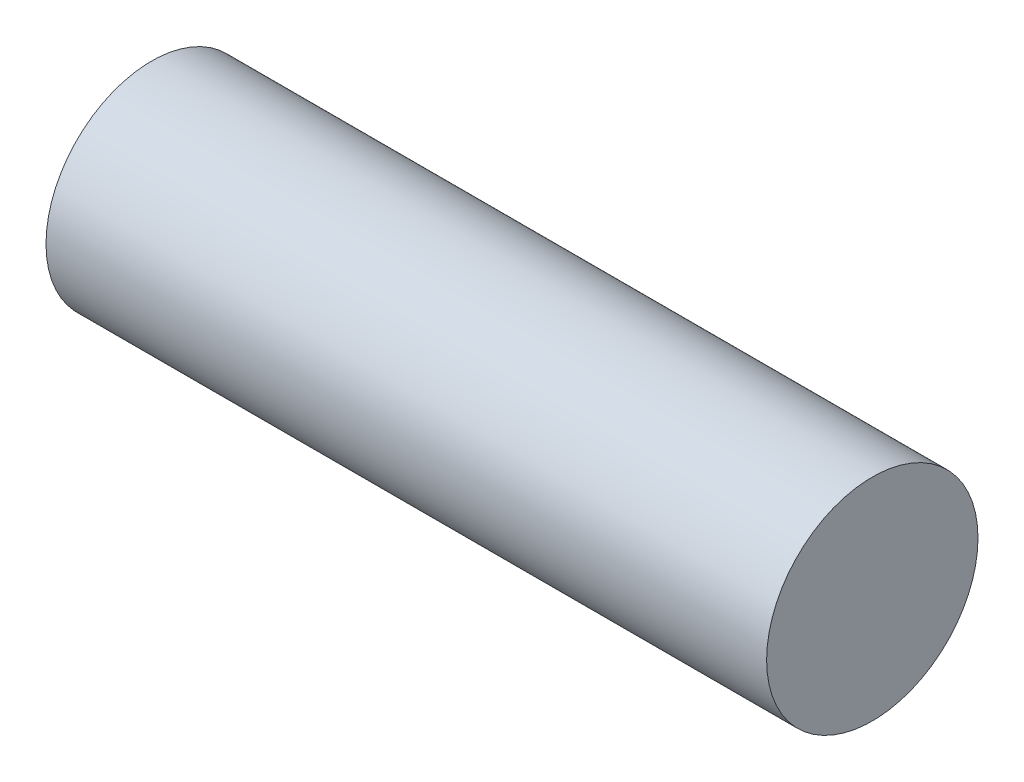
ISO-10303-21;
HEADER;
FILE_DESCRIPTION(('STEP AP214'),'2;1');
FILE_NAME('part.step','',(''),(''),'','','');
FILE_SCHEMA(('AUTOMOTIVE_DESIGN { 1 0 10303 214 1 1 1 1 }'));
ENDSEC;
DATA;
#1=APPLICATION_CONTEXT('core data for automotive mechanical design processes');
#2=APPLICATION_PROTOCOL_DEFINITION('international standard','automotive_design',2000,#1);
#3=PRODUCT_CONTEXT('',#1,'mechanical');
#4=PRODUCT('Part','Part','',(#3));
#5=PRODUCT_RELATED_PRODUCT_CATEGORY('part','',(#4));
#6=PRODUCT_DEFINITION_FORMATION('','',#4);
#7=PRODUCT_DEFINITION_CONTEXT('part definition',#1,'design');
#8=PRODUCT_DEFINITION('design','',#6,#7);
#9=PRODUCT_DEFINITION_SHAPE('','',#8);
#10=(LENGTH_UNIT() NAMED_UNIT(*) SI_UNIT(.MILLI.,.METRE.));
#11=(NAMED_UNIT(*) PLANE_ANGLE_UNIT() SI_UNIT($,.RADIAN.));
#12=(NAMED_UNIT(*) SI_UNIT($,.STERADIAN.) SOLID_ANGLE_UNIT());
#13=UNCERTAINTY_MEASURE_WITH_UNIT(LENGTH_MEASURE(1.E-05),#10,'distance_accuracy_value','');
#14=(GEOMETRIC_REPRESENTATION_CONTEXT(3) GLOBAL_UNCERTAINTY_ASSIGNED_CONTEXT((#13)) GLOBAL_UNIT_ASSIGNED_CONTEXT((#10,
#11,#12)) REPRESENTATION_CONTEXT('',''));
#15=CARTESIAN_POINT('',(0.,0.,0.));
#16=DIRECTION('',(0.,0.,1.));
#17=DIRECTION('',(1.,0.,0.));
#18=AXIS2_PLACEMENT_3D('',#15,#16,#17);
#19=CARTESIAN_POINT('',(30.,0.,0.));
#20=DIRECTION('',(-1.,0.,0.));
#21=DIRECTION('',(0.,0.,1.));
#22=AXIS2_PLACEMENT_3D('',#19,#20,#21);
#23=CYLINDRICAL_SURFACE('',#22,4.4);
#24=CARTESIAN_POINT('',(30.,0.,0.));
#25=DIRECTION('',(1.,0.,0.));
#26=DIRECTION('',(0.,0.,-1.));
#27=AXIS2_PLACEMENT_3D('',#24,#25,#26);
#28=CIRCLE('',#27,4.4);
#29=CARTESIAN_POINT('',(30.,0.,-4.4));
#30=VERTEX_POINT('',#29);
#31=EDGE_CURVE('E10',#30,#30,#28,.T.);
#32=ORIENTED_EDGE('',*,*,#31,.F.);
#33=EDGE_LOOP('',(#32));
#34=FACE_BOUND('',#33,.T.);
#35=CARTESIAN_POINT('',(0.,0.,0.));
#36=DIRECTION('',(1.,0.,0.));
#37=DIRECTION('',(0.,0.,-1.));
#38=AXIS2_PLACEMENT_3D('',#35,#36,#37);
#39=CIRCLE('',#38,4.4);
#40=CARTESIAN_POINT('',(0.,0.,-4.4));
#41=VERTEX_POINT('',#40);
#42=EDGE_CURVE('E46',#41,#41,#39,.T.);
#43=ORIENTED_EDGE('',*,*,#42,.T.);
#44=EDGE_LOOP('',(#43));
#45=FACE_BOUND('',#44,.T.);
#46=ADVANCED_FACE('F43',(#34,#45),#23,.T.);
#47=CARTESIAN_POINT('',(30.,0.,0.));
#48=DIRECTION('',(1.,0.,0.));
#49=DIRECTION('',(0.,0.,-1.));
#50=AXIS2_PLACEMENT_3D('',#47,#48,#49);
#51=PLANE('',#50);
#52=ORIENTED_EDGE('',*,*,#31,.T.);
#53=EDGE_LOOP('',(#52));
#54=FACE_BOUND('',#53,.T.);
#55=ADVANCED_FACE('F60',(#54),#51,.T.);
#56=CARTESIAN_POINT('',(0.,0.,0.));
#57=DIRECTION('',(1.,0.,0.));
#58=DIRECTION('',(0.,0.,-1.));
#59=AXIS2_PLACEMENT_3D('',#56,#57,#58);
#60=PLANE('',#59);
#61=ORIENTED_EDGE('',*,*,#42,.F.);
#62=EDGE_LOOP('',(#61));
#63=FACE_BOUND('',#62,.T.);
#64=ADVANCED_FACE('F58',(#63),#60,.F.);
#65=CLOSED_SHELL('',(#46,#55,#64));
#66=MANIFOLD_SOLID_BREP('B2',#65);
#67=ADVANCED_BREP_SHAPE_REPRESENTATION('',(#18,#66),#14);
#68=SHAPE_DEFINITION_REPRESENTATION(#9,#67);
ENDSEC;
END-ISO-10303-21;
